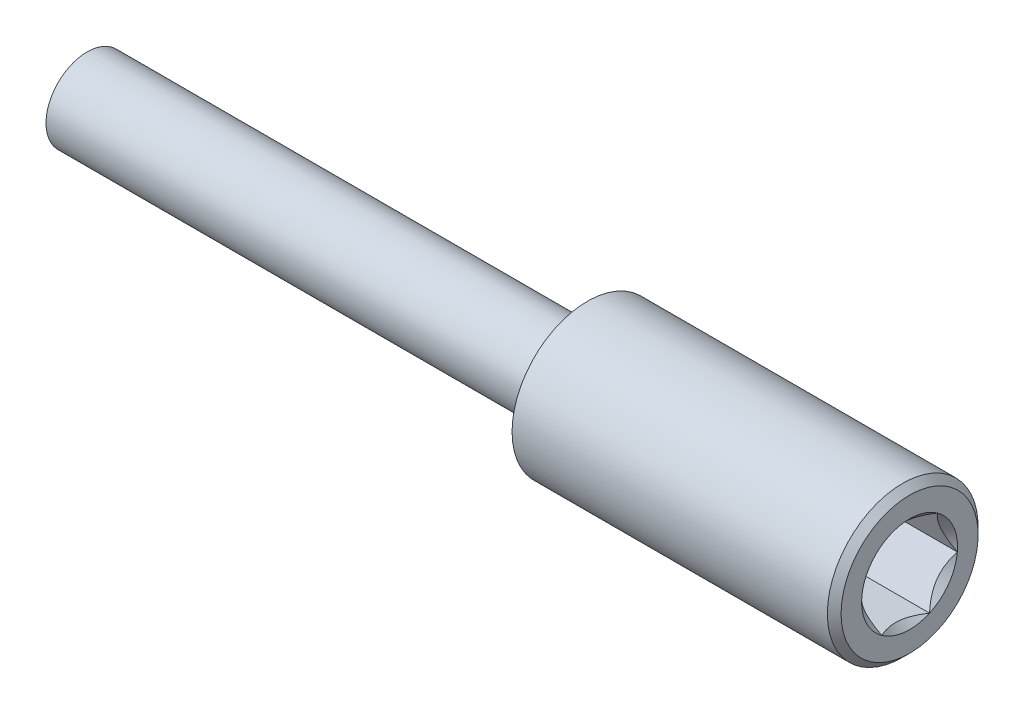
ISO-10303-21;
HEADER;
FILE_DESCRIPTION(('STEP AP214'),'2;1');
FILE_NAME('part.step','',(''),(''),'','','');
FILE_SCHEMA(('AUTOMOTIVE_DESIGN { 1 0 10303 214 1 1 1 1 }'));
ENDSEC;
DATA;
#1=APPLICATION_CONTEXT('core data for automotive mechanical design processes');
#2=APPLICATION_PROTOCOL_DEFINITION('international standard','automotive_design',2000,#1);
#3=PRODUCT_CONTEXT('',#1,'mechanical');
#4=PRODUCT('Part','Part','',(#3));
#5=PRODUCT_RELATED_PRODUCT_CATEGORY('part','',(#4));
#6=PRODUCT_DEFINITION_FORMATION('','',#4);
#7=PRODUCT_DEFINITION_CONTEXT('part definition',#1,'design');
#8=PRODUCT_DEFINITION('design','',#6,#7);
#9=PRODUCT_DEFINITION_SHAPE('','',#8);
#10=(LENGTH_UNIT() NAMED_UNIT(*) SI_UNIT(.MILLI.,.METRE.));
#11=(NAMED_UNIT(*) PLANE_ANGLE_UNIT() SI_UNIT($,.RADIAN.));
#12=(NAMED_UNIT(*) SI_UNIT($,.STERADIAN.) SOLID_ANGLE_UNIT());
#13=UNCERTAINTY_MEASURE_WITH_UNIT(LENGTH_MEASURE(1.E-05),#10,'distance_accuracy_value','');
#14=(GEOMETRIC_REPRESENTATION_CONTEXT(3) GLOBAL_UNCERTAINTY_ASSIGNED_CONTEXT((#13)) GLOBAL_UNIT_ASSIGNED_CONTEXT((#10,
#11,#12)) REPRESENTATION_CONTEXT('',''));
#15=CARTESIAN_POINT('',(0.,0.,0.));
#16=DIRECTION('',(0.,0.,1.));
#17=DIRECTION('',(1.,0.,0.));
#18=AXIS2_PLACEMENT_3D('',#15,#16,#17);
#19=CARTESIAN_POINT('',(59.5,0.,0.));
#20=DIRECTION('',(1.,0.,0.));
#21=DIRECTION('',(0.,0.,-1.));
#22=AXIS2_PLACEMENT_3D('',#19,#20,#21);
#23=CONICAL_SURFACE('',#22,3.,0.785398163397448);
#24=CARTESIAN_POINT('',(60.,0.,0.));
#25=DIRECTION('',(-1.,0.,0.));
#26=DIRECTION('',(0.,0.,1.));
#27=AXIS2_PLACEMENT_3D('',#24,#25,#26);
#28=CIRCLE('',#27,3.5);
#29=CARTESIAN_POINT('',(60.,-0.332480475621756,-3.48417231682509));
#30=VERTEX_POINT('',#29);
#31=CARTESIAN_POINT('',(60.,-3.18362197534389,-1.45414962026178));
#32=VERTEX_POINT('',#31);
#33=EDGE_CURVE('E203',#30,#32,#28,.T.);
#34=ORIENTED_EDGE('',*,*,#33,.F.);
#35=CARTESIAN_POINT('',(60.0001227643079,-0.332280475621751,-3.48431471752297));
#36=CARTESIAN_POINT('',(59.9400184649852,-0.430287651632948,-3.41453326621717));
#37=CARTESIAN_POINT('',(59.8834442018458,-0.529933641265409,-3.34358497389456));
#38=CARTESIAN_POINT('',(59.779858109961,-0.733122746907622,-3.19891362167009));
#39=CARTESIAN_POINT('',(59.7329039155234,-0.836685186248848,-3.1251768034888));
#40=CARTESIAN_POINT('',(59.6524704780716,-1.04551387618945,-2.97649004756514));
#41=CARTESIAN_POINT('',(59.6187890710241,-1.15072694511571,-2.9015779753596));
#42=CARTESIAN_POINT('',(59.5668959277097,-1.36346937048158,-2.75010462615658));
#43=CARTESIAN_POINT('',(59.548645455229,-1.47099222795744,-2.67354797644396));
#44=CARTESIAN_POINT('',(59.5321787016966,-1.65630263429938,-2.54160632050715));
#45=CARTESIAN_POINT('',(59.5297410907443,-1.73385085854029,-2.48639171425117));
#46=CARTESIAN_POINT('',(59.5338481550161,-1.88882117714828,-2.37605230664951));
#47=CARTESIAN_POINT('',(59.5403959791797,-1.96624321777301,-2.32092754356856));
#48=CARTESIAN_POINT('',(59.5621000444776,-2.12035382194239,-2.21120025564706));
#49=CARTESIAN_POINT('',(59.5772659149578,-2.19704146728263,-2.15659838457126));
#50=CARTESIAN_POINT('',(59.6153782933601,-2.34909968042144,-2.04833240622515));
#51=CARTESIAN_POINT('',(59.6383242047838,-2.42447034872738,-1.99466822739322));
#52=CARTESIAN_POINT('',(59.6855351614645,-2.55827709080356,-1.8993973601303));
#53=CARTESIAN_POINT('',(59.7085593472534,-2.61700930086291,-1.85757982162811));
#54=CARTESIAN_POINT('',(59.7583185724391,-2.73341926963525,-1.77469551766176));
#55=CARTESIAN_POINT('',(59.78505372513,-2.79109699609446,-1.73362877516238));
#56=CARTESIAN_POINT('',(59.8416354626562,-2.9052162901392,-1.65237543959514));
#57=CARTESIAN_POINT('',(59.8714722639292,-2.96166110360027,-1.61218653545256));
#58=CARTESIAN_POINT('',(59.9338654192506,-3.07350533311303,-1.53255305377069));
#59=CARTESIAN_POINT('',(59.9664201040844,-3.12890536556527,-1.49310803735206));
#60=CARTESIAN_POINT('',(60.0001227643079,-3.18382197534389,-1.4540072195639));
#61=B_SPLINE_CURVE_WITH_KNOTS('',3,(#35,#36,#37,#38,#39,#40,#41,#42,#43,#44,#45,#46,#47,#48,#49,
#50,#51,#52,#53,#54,#55,#56,#57,#58,#59,#60),.UNSPECIFIED.,.F.,.F.,(4,2,2,2,2,2,2,2,2,2,2,2,4),
(0.,0.403747524010755,0.809847411676119,1.20949767232449,1.60814168848214,1.89342103429884,
2.17880038159955,2.46449922533792,2.75017616939724,2.97712615115418,3.20408306311442,
3.43034463854694,3.65646826132234),.UNSPECIFIED.);
#62=EDGE_CURVE('E92',#30,#32,#61,.T.);
#63=ORIENTED_EDGE('',*,*,#62,.T.);
#64=EDGE_LOOP('',(#34,#63));
#65=FACE_BOUND('',#64,.T.);
#66=ADVANCED_FACE('F33',(#65),#23,.F.);
#67=CARTESIAN_POINT('',(60.,-2.85114149972214,2.03002269656331));
#68=VERTEX_POINT('',#67);
#69=EDGE_CURVE('E200',#32,#68,#28,.T.);
#70=ORIENTED_EDGE('',*,*,#69,.F.);
#71=CARTESIAN_POINT('',(60.0001004585984,-3.18364106053517,-1.45434962026178));
#72=CARTESIAN_POINT('',(59.9399986422745,-3.17221239446891,-1.33458486760425));
#73=CARTESIAN_POINT('',(59.8834268211516,-3.16059262810559,-1.21281751204651));
#74=CARTESIAN_POINT('',(59.7798453879084,-3.1368986645929,-0.964520671179666));
#75=CARTESIAN_POINT('',(59.7328934042563,-3.1248222143666,-0.837967575135955));
#76=CARTESIAN_POINT('',(59.6524638590217,-3.10047063467849,-0.58277935795841));
#77=CARTESIAN_POINT('',(59.6187841526979,-3.08820170614936,-0.45420921843856));
#78=CARTESIAN_POINT('',(59.5668937293435,-3.06339375856841,-0.194238571930213));
#79=CARTESIAN_POINT('',(59.5486442807415,-3.05085549726763,-0.0628460056641706));
#80=CARTESIAN_POINT('',(59.5321783788918,-3.0292462040212,0.163604889458532));
#81=CARTESIAN_POINT('',(59.5297410190727,-3.02020307670531,0.258370796517042));
#82=CARTESIAN_POINT('',(59.5338485571552,-3.00213153276675,0.447748452438848));
#83=CARTESIAN_POINT('',(59.540396603883,-2.9931031224117,0.542360135621654));
#84=CARTESIAN_POINT('',(59.5621010720019,-2.97513183712947,0.730687148090679));
#85=CARTESIAN_POINT('',(59.5772671218345,-2.96618906926906,0.824401355388862));
#86=CARTESIAN_POINT('',(59.6153798118535,-2.94845712263972,1.01022025935264));
#87=CARTESIAN_POINT('',(59.6383258555062,-2.9396679321495,1.10232507884939));
#88=CARTESIAN_POINT('',(59.6855357452147,-2.92406476091759,1.26583584488525));
#89=CARTESIAN_POINT('',(59.7085584836409,-2.91721623963544,1.33760375311456));
#90=CARTESIAN_POINT('',(59.7583143707402,-2.9036421448711,1.47985115911766));
#91=CARTESIAN_POINT('',(59.785047632437,-2.89691657514112,1.55033061757086));
#92=CARTESIAN_POINT('',(59.8416252414419,-2.88360957241706,1.68977907818912));
#93=CARTESIAN_POINT('',(59.8714598058761,-2.87702776094299,1.75875204657061));
#94=CARTESIAN_POINT('',(59.9338482201645,-2.86398602997516,1.89542063715966));
#95=CARTESIAN_POINT('',(59.9664004014243,-2.8575260386289,1.96311701233314));
#96=CARTESIAN_POINT('',(60.0001004585984,-2.85112241453085,2.03022269656331));
#97=B_SPLINE_CURVE_WITH_KNOTS('',3,(#71,#72,#73,#74,#75,#76,#77,#78,#79,#80,#81,#82,#83,#84,#85,
#86,#87,#88,#89,#90,#91,#92,#93,#94,#95,#96),.UNSPECIFIED.,.F.,.F.,(4,2,2,2,2,2,2,2,2,2,2,2,4),
(0.,0.403736953958613,0.809826034472715,1.20946604737607,1.60809991831549,1.89337885832153,
2.17875779639031,2.46445620198937,2.75013270652109,2.9770686230892,3.20401145370647,
3.4302589638345,3.65636856734248),.UNSPECIFIED.);
#98=EDGE_CURVE('E170',#32,#68,#97,.T.);
#99=ORIENTED_EDGE('',*,*,#98,.T.);
#100=EDGE_LOOP('',(#70,#99));
#101=FACE_BOUND('',#100,.T.);
#102=ADVANCED_FACE('F215',(#101),#23,.F.);
#103=CARTESIAN_POINT('',(60.,0.332480475621752,3.48417231682509));
#104=VERTEX_POINT('',#103);
#105=EDGE_CURVE('E192',#68,#104,#28,.T.);
#106=ORIENTED_EDGE('',*,*,#105,.F.);
#107=CARTESIAN_POINT('',(60.0001099428553,-2.85134149972214,2.02993134466089));
#108=CARTESIAN_POINT('',(59.94000707078,-2.74190680829199,2.07991668092853));
#109=CARTESIAN_POINT('',(59.883434211331,-2.63064223381862,2.13073783368224));
#110=CARTESIAN_POINT('',(59.7798507972696,-2.40376164138351,2.23436770239448));
#111=CARTESIAN_POINT('',(59.7328978736084,-2.28812404826025,2.28718627301325));
#112=CARTESIAN_POINT('',(59.65246667343,-2.05494640526849,2.3936923794656));
#113=CARTESIAN_POINT('',(59.6187862439688,-1.93746573463849,2.44735279326717));
#114=CARTESIAN_POINT('',(59.5668946640999,-1.69991810076775,2.5558549346214));
#115=CARTESIAN_POINT('',(59.5486447801468,-1.57985839373133,2.61069334783373));
#116=CARTESIAN_POINT('',(59.5321785161534,-1.37294017795202,2.70520521112373));
#117=CARTESIAN_POINT('',(59.529741049547,-1.28634888153384,2.74475660943033));
#118=CARTESIAN_POINT('',(59.5338483861532,-1.11330713960703,2.8237950710508));
#119=CARTESIAN_POINT('',(59.5403963382404,-1.02685675411091,2.86328210695338));
#120=CARTESIAN_POINT('',(59.5621006350665,-0.854775006367357,2.94188208209906));
#121=CARTESIAN_POINT('',(59.5772666086316,-0.769144669355587,2.98099455305602));
#122=CARTESIAN_POINT('',(59.6153791661373,-0.599354664595003,3.05854775279487));
#123=CARTESIAN_POINT('',(59.6383251535592,-0.515194884613918,3.09698853283993));
#124=CARTESIAN_POINT('',(59.6855354969358,-0.365786993656705,3.16523200822179));
#125=CARTESIAN_POINT('',(59.7085588507772,-0.300208173571147,3.19518575809008));
#126=CARTESIAN_POINT('',(59.7583161572219,-0.170227864760296,3.25455550052892));
#127=CARTESIAN_POINT('',(59.7850502229638,-0.105826412000395,3.28397147667194));
#128=CARTESIAN_POINT('',(59.8416295874039,0.0215962681448328,3.34217299788927));
#129=CARTESIAN_POINT('',(59.8714651029353,0.0846211197431761,3.37096019835734));
#130=CARTESIAN_POINT('',(59.9338555330978,0.209503601389775,3.42800145974772));
#131=CARTESIAN_POINT('',(59.9664087788708,0.271361919565443,3.45625583497877));
#132=CARTESIAN_POINT('',(60.0001099428553,0.332680475621751,3.48426366872752));
#133=B_SPLINE_CURVE_WITH_KNOTS('',3,(#107,#108,#109,#110,#111,#112,#113,#114,#115,#116,#117,
#118,#119,#120,#121,#122,#123,#124,#125,#126,#127,#128,#129,#130,#131,#132),.UNSPECIFIED.,.F.,
.F.,(4,2,2,2,2,2,2,2,2,2,2,2,4),(0.,0.403741448249491,0.80983512386516,1.2094794940198,
1.60811767861781,1.89339679115885,2.17877590321721,2.46447449509726,2.75015118650036,
2.97709308359678,3.20404190161065,3.43029539231469,3.65641095682473),.UNSPECIFIED.);
#134=EDGE_CURVE('E217',#68,#104,#133,.T.);
#135=ORIENTED_EDGE('',*,*,#134,.T.);
#136=EDGE_LOOP('',(#106,#135));
#137=FACE_BOUND('',#136,.T.);
#138=ADVANCED_FACE('F220',(#137),#23,.F.);
#139=CARTESIAN_POINT('',(60.,3.18362197534389,1.45414962026178));
#140=VERTEX_POINT('',#139);
#141=EDGE_CURVE('E42',#104,#140,#28,.T.);
#142=ORIENTED_EDGE('',*,*,#141,.F.);
#143=CARTESIAN_POINT('',(60.0001227643079,0.332280475621753,3.48431471752297));
#144=CARTESIAN_POINT('',(59.9400184649852,0.43028765163295,3.41453326621717));
#145=CARTESIAN_POINT('',(59.8834442018458,0.52993364126541,3.34358497389456));
#146=CARTESIAN_POINT('',(59.779858109961,0.733122746907623,3.19891362167009));
#147=CARTESIAN_POINT('',(59.7329039155234,0.836685186248848,3.1251768034888));
#148=CARTESIAN_POINT('',(59.6524704780716,1.04551387618945,2.97649004756514));
#149=CARTESIAN_POINT('',(59.6187890710241,1.15072694511571,2.90157797535961));
#150=CARTESIAN_POINT('',(59.5668959277097,1.36346937048158,2.75010462615658));
#151=CARTESIAN_POINT('',(59.548645455229,1.47099222795744,2.67354797644396));
#152=CARTESIAN_POINT('',(59.5321787016966,1.65630263429938,2.54160632050715));
#153=CARTESIAN_POINT('',(59.5297410907443,1.73385085854029,2.48639171425117));
#154=CARTESIAN_POINT('',(59.5338481550161,1.88882117714828,2.37605230664951));
#155=CARTESIAN_POINT('',(59.5403959791797,1.96624321777301,2.32092754356856));
#156=CARTESIAN_POINT('',(59.5621000444776,2.12035382194239,2.21120025564706));
#157=CARTESIAN_POINT('',(59.5772659149578,2.19704146728263,2.15659838457126));
#158=CARTESIAN_POINT('',(59.6153782933601,2.34909968042143,2.04833240622515));
#159=CARTESIAN_POINT('',(59.6383242047838,2.42447034872737,1.99466822739323));
#160=CARTESIAN_POINT('',(59.6855351614645,2.55827709080356,1.8993973601303));
#161=CARTESIAN_POINT('',(59.7085593472534,2.61700930086292,1.85757982162811));
#162=CARTESIAN_POINT('',(59.7583185724391,2.73341926963525,1.77469551766175));
#163=CARTESIAN_POINT('',(59.78505372513,2.79109699609446,1.73362877516238));
#164=CARTESIAN_POINT('',(59.8416354626563,2.90521629013921,1.65237543959514));
#165=CARTESIAN_POINT('',(59.8714722639292,2.96166110360028,1.61218653545256));
#166=CARTESIAN_POINT('',(59.9338654192505,3.07350533311304,1.53255305377069));
#167=CARTESIAN_POINT('',(59.9664201040844,3.12890536556528,1.49310803735206));
#168=CARTESIAN_POINT('',(60.0001227643079,3.18382197534389,1.4540072195639));
#169=B_SPLINE_CURVE_WITH_KNOTS('',3,(#143,#144,#145,#146,#147,#148,#149,#150,#151,#152,#153,
#154,#155,#156,#157,#158,#159,#160,#161,#162,#163,#164,#165,#166,#167,#168),.UNSPECIFIED.,.F.,
.F.,(4,2,2,2,2,2,2,2,2,2,2,2,4),(0.,0.403747524010754,0.809847411676117,1.20949767232449,
1.60814168848214,1.89342103429884,2.17880038159955,2.46449922533791,2.75017616939724,
2.97712615115418,3.20408306311442,3.43034463854694,3.65646826132234),.UNSPECIFIED.);
#170=EDGE_CURVE('E222',#104,#140,#169,.T.);
#171=ORIENTED_EDGE('',*,*,#170,.T.);
#172=EDGE_LOOP('',(#142,#171));
#173=FACE_BOUND('',#172,.T.);
#174=ADVANCED_FACE('F260',(#173),#23,.F.);
#175=CARTESIAN_POINT('',(60.,2.85114149972214,-2.03002269656331));
#176=VERTEX_POINT('',#175);
#177=EDGE_CURVE('E194',#140,#176,#28,.T.);
#178=ORIENTED_EDGE('',*,*,#177,.F.);
#179=CARTESIAN_POINT('',(60.0001004585984,3.18364106053517,1.45434962026178));
#180=CARTESIAN_POINT('',(59.9399986422745,3.17221239446891,1.33458486760425));
#181=CARTESIAN_POINT('',(59.8834268211516,3.16059262810559,1.21281751204651));
#182=CARTESIAN_POINT('',(59.7798453879084,3.1368986645929,0.964520671179666));
#183=CARTESIAN_POINT('',(59.7328934042563,3.1248222143666,0.837967575135956));
#184=CARTESIAN_POINT('',(59.6524638590217,3.10047063467849,0.582779357958415));
#185=CARTESIAN_POINT('',(59.6187841526979,3.08820170614936,0.454209218438566));
#186=CARTESIAN_POINT('',(59.5668937293435,3.06339375856841,0.19423857193022));
#187=CARTESIAN_POINT('',(59.5486442807415,3.05085549726763,0.0628460056641774));
#188=CARTESIAN_POINT('',(59.5321783788918,3.0292462040212,-0.163604889458526));
#189=CARTESIAN_POINT('',(59.5297410190727,3.02020307670531,-0.258370796517035));
#190=CARTESIAN_POINT('',(59.5338485571552,3.00213153276675,-0.447748452438841));
#191=CARTESIAN_POINT('',(59.540396603883,2.9931031224117,-0.542360135621647));
#192=CARTESIAN_POINT('',(59.5621010720019,2.97513183712947,-0.730687148090672));
#193=CARTESIAN_POINT('',(59.5772671218345,2.96618906926907,-0.824401355388855));
#194=CARTESIAN_POINT('',(59.6153798118535,2.94845712263972,-1.01022025935263));
#195=CARTESIAN_POINT('',(59.6383258555062,2.9396679321495,-1.10232507884938));
#196=CARTESIAN_POINT('',(59.6855357452147,2.92406476091759,-1.26583584488524));
#197=CARTESIAN_POINT('',(59.7085584836409,2.91721623963544,-1.33760375311456));
#198=CARTESIAN_POINT('',(59.7583143707402,2.9036421448711,-1.47985115911766));
#199=CARTESIAN_POINT('',(59.785047632437,2.89691657514112,-1.55033061757086));
#200=CARTESIAN_POINT('',(59.8416252414419,2.88360957241706,-1.68977907818912));
#201=CARTESIAN_POINT('',(59.8714598058761,2.87702776094299,-1.75875204657061));
#202=CARTESIAN_POINT('',(59.9338482201645,2.86398602997516,-1.89542063715966));
#203=CARTESIAN_POINT('',(59.9664004014243,2.8575260386289,-1.96311701233314));
#204=CARTESIAN_POINT('',(60.0001004585984,2.85112241453086,-2.03022269656331));
#205=B_SPLINE_CURVE_WITH_KNOTS('',3,(#179,#180,#181,#182,#183,#184,#185,#186,#187,#188,#189,
#190,#191,#192,#193,#194,#195,#196,#197,#198,#199,#200,#201,#202,#203,#204),.UNSPECIFIED.,.F.,
.F.,(4,2,2,2,2,2,2,2,2,2,2,2,4),(0.,0.403736953958614,0.809826034472712,1.20946604737607,
1.60809991831548,1.89337885832152,2.1787577963903,2.46445620198936,2.75013270652108,
2.97706862308919,3.20401145370647,3.4302589638345,3.65636856734248),.UNSPECIFIED.);
#206=EDGE_CURVE('E139',#140,#176,#205,.T.);
#207=ORIENTED_EDGE('',*,*,#206,.T.);
#208=EDGE_LOOP('',(#178,#207));
#209=FACE_BOUND('',#208,.T.);
#210=ADVANCED_FACE('F251',(#209),#23,.F.);
#211=CARTESIAN_POINT('',(0.,0.,-3.));
#212=DIRECTION('',(1.,0.,0.));
#213=DIRECTION('',(0.,0.,-1.));
#214=AXIS2_PLACEMENT_3D('',#211,#212,#213);
#215=PLANE('',#214);
#216=CARTESIAN_POINT('',(0.,0.,0.));
#217=DIRECTION('',(-1.,0.,0.));
#218=DIRECTION('',(0.,0.,1.));
#219=AXIS2_PLACEMENT_3D('',#216,#217,#218);
#220=CIRCLE('',#219,3.);
#221=CARTESIAN_POINT('',(0.,0.,3.));
#222=VERTEX_POINT('',#221);
#223=EDGE_CURVE('E177',#222,#222,#220,.T.);
#224=ORIENTED_EDGE('',*,*,#223,.T.);
#225=EDGE_LOOP('',(#224));
#226=FACE_BOUND('',#225,.T.);
#227=ADVANCED_FACE('F35',(#226),#215,.F.);
#228=EDGE_CURVE('E199',#176,#30,#28,.T.);
#229=ORIENTED_EDGE('',*,*,#228,.F.);
#230=CARTESIAN_POINT('',(60.0001099428553,2.85134149972214,-2.02993134466089));
#231=CARTESIAN_POINT('',(59.94000707078,2.74190680829199,-2.07991668092853));
#232=CARTESIAN_POINT('',(59.883434211331,2.63064223381862,-2.13073783368224));
#233=CARTESIAN_POINT('',(59.7798507972696,2.40376164138351,-2.23436770239448));
#234=CARTESIAN_POINT('',(59.7328978736084,2.28812404826026,-2.28718627301325));
#235=CARTESIAN_POINT('',(59.65246667343,2.05494640526849,-2.3936923794656));
#236=CARTESIAN_POINT('',(59.6187862439688,1.93746573463849,-2.44735279326717));
#237=CARTESIAN_POINT('',(59.5668946640999,1.69991810076775,-2.5558549346214));
#238=CARTESIAN_POINT('',(59.5486447801468,1.57985839373133,-2.61069334783373));
#239=CARTESIAN_POINT('',(59.5321785161534,1.37294017795202,-2.70520521112372));
#240=CARTESIAN_POINT('',(59.529741049547,1.28634888153384,-2.74475660943033));
#241=CARTESIAN_POINT('',(59.5338483861532,1.11330713960703,-2.8237950710508));
#242=CARTESIAN_POINT('',(59.5403963382404,1.02685675411091,-2.86328210695338));
#243=CARTESIAN_POINT('',(59.5621006350665,0.854775006367358,-2.94188208209906));
#244=CARTESIAN_POINT('',(59.5772666086316,0.769144669355587,-2.98099455305602));
#245=CARTESIAN_POINT('',(59.6153791661373,0.599354664595004,-3.05854775279487));
#246=CARTESIAN_POINT('',(59.6383251535593,0.51519488461392,-3.09698853283993));
#247=CARTESIAN_POINT('',(59.6855354969358,0.365786993656706,-3.16523200822179));
#248=CARTESIAN_POINT('',(59.7085588507772,0.300208173571147,-3.19518575809008));
#249=CARTESIAN_POINT('',(59.7583161572219,0.170227864760296,-3.25455550052892));
#250=CARTESIAN_POINT('',(59.7850502229638,0.105826412000396,-3.28397147667194));
#251=CARTESIAN_POINT('',(59.8416295874039,-0.0215962681448316,-3.34217299788927));
#252=CARTESIAN_POINT('',(59.8714651029353,-0.0846211197431752,-3.37096019835734));
#253=CARTESIAN_POINT('',(59.9338555330978,-0.209503601389774,-3.42800145974772));
#254=CARTESIAN_POINT('',(59.9664087788708,-0.271361919565443,-3.45625583497877));
#255=CARTESIAN_POINT('',(60.0001099428553,-0.332680475621749,-3.48426366872751));
#256=B_SPLINE_CURVE_WITH_KNOTS('',3,(#230,#231,#232,#233,#234,#235,#236,#237,#238,#239,#240,
#241,#242,#243,#244,#245,#246,#247,#248,#249,#250,#251,#252,#253,#254,#255),.UNSPECIFIED.,.F.,
.F.,(4,2,2,2,2,2,2,2,2,2,2,2,4),(0.,0.403741448249492,0.809835123865161,1.2094794940198,
1.60811767861782,1.89339679115885,2.17877590321721,2.46447449509726,2.75015118650036,
2.97709308359678,3.20404190161065,3.4302953923147,3.65641095682473),.UNSPECIFIED.);
#257=EDGE_CURVE('E121',#176,#30,#256,.T.);
#258=ORIENTED_EDGE('',*,*,#257,.T.);
#259=EDGE_LOOP('',(#229,#258));
#260=FACE_BOUND('',#259,.T.);
#261=ADVANCED_FACE('F146',(#260),#23,.F.);
#262=CARTESIAN_POINT('',(60.,0.,-3.5));
#263=DIRECTION('',(-1.,0.,0.));
#264=DIRECTION('',(0.,0.,1.));
#265=AXIS2_PLACEMENT_3D('',#262,#263,#264);
#266=PLANE('',#265);
#267=CARTESIAN_POINT('',(60.,0.,0.));
#268=DIRECTION('',(-1.,0.,0.));
#269=DIRECTION('',(0.,0.,1.));
#270=AXIS2_PLACEMENT_3D('',#267,#268,#269);
#271=CIRCLE('',#270,5.);
#272=CARTESIAN_POINT('',(60.,0.,5.));
#273=VERTEX_POINT('',#272);
#274=EDGE_CURVE('E189',#273,#273,#271,.T.);
#275=ORIENTED_EDGE('',*,*,#274,.F.);
#276=EDGE_LOOP('',(#275));
#277=FACE_BOUND('',#276,.T.);
#278=ORIENTED_EDGE('',*,*,#141,.T.);
#279=ORIENTED_EDGE('',*,*,#177,.T.);
#280=ORIENTED_EDGE('',*,*,#228,.T.);
#281=ORIENTED_EDGE('',*,*,#33,.T.);
#282=ORIENTED_EDGE('',*,*,#69,.T.);
#283=ORIENTED_EDGE('',*,*,#105,.T.);
#284=EDGE_LOOP('',(#278,#279,#280,#281,#282,#283));
#285=FACE_BOUND('',#284,.T.);
#286=ADVANCED_FACE('F209',(#277,#285),#266,.F.);
#287=CARTESIAN_POINT('',(60.,0.,0.));
#288=DIRECTION('',(-1.,0.,0.));
#289=DIRECTION('',(0.,0.,1.));
#290=AXIS2_PLACEMENT_3D('',#287,#288,#289);
#291=CONICAL_SURFACE('',#290,5.,0.785398163397447);
#292=CARTESIAN_POINT('',(59.5,0.,0.));
#293=DIRECTION('',(-1.,0.,0.));
#294=DIRECTION('',(0.,0.,1.));
#295=AXIS2_PLACEMENT_3D('',#292,#293,#294);
#296=CIRCLE('',#295,5.5);
#297=CARTESIAN_POINT('',(59.5,0.,5.5));
#298=VERTEX_POINT('',#297);
#299=EDGE_CURVE('E186',#298,#298,#296,.T.);
#300=ORIENTED_EDGE('',*,*,#299,.F.);
#301=EDGE_LOOP('',(#300));
#302=FACE_BOUND('',#301,.T.);
#303=ORIENTED_EDGE('',*,*,#274,.T.);
#304=EDGE_LOOP('',(#303));
#305=FACE_BOUND('',#304,.T.);
#306=ADVANCED_FACE('F256',(#302,#305),#291,.T.);
#307=CARTESIAN_POINT('',(0.,0.,0.));
#308=DIRECTION('',(-1.,0.,0.));
#309=DIRECTION('',(0.,0.,1.));
#310=AXIS2_PLACEMENT_3D('',#307,#308,#309);
#311=CYLINDRICAL_SURFACE('',#310,5.5);
#312=CARTESIAN_POINT('',(36.5,0.,0.));
#313=DIRECTION('',(-1.,0.,0.));
#314=DIRECTION('',(0.,0.,1.));
#315=AXIS2_PLACEMENT_3D('',#312,#313,#314);
#316=CIRCLE('',#315,5.5);
#317=CARTESIAN_POINT('',(36.5,0.,5.5));
#318=VERTEX_POINT('',#317);
#319=EDGE_CURVE('E183',#318,#318,#316,.T.);
#320=ORIENTED_EDGE('',*,*,#319,.F.);
#321=EDGE_LOOP('',(#320));
#322=FACE_BOUND('',#321,.T.);
#323=ORIENTED_EDGE('',*,*,#299,.T.);
#324=EDGE_LOOP('',(#323));
#325=FACE_BOUND('',#324,.T.);
#326=ADVANCED_FACE('F327',(#322,#325),#311,.T.);
#327=CARTESIAN_POINT('',(36.5,0.,-5.5));
#328=DIRECTION('',(1.,0.,0.));
#329=DIRECTION('',(0.,0.,-1.));
#330=AXIS2_PLACEMENT_3D('',#327,#328,#329);
#331=PLANE('',#330);
#332=CARTESIAN_POINT('',(36.5,0.,0.));
#333=DIRECTION('',(-1.,0.,0.));
#334=DIRECTION('',(0.,0.,1.));
#335=AXIS2_PLACEMENT_3D('',#332,#333,#334);
#336=CIRCLE('',#335,3.);
#337=CARTESIAN_POINT('',(36.5,0.,3.));
#338=VERTEX_POINT('',#337);
#339=EDGE_CURVE('E180',#338,#338,#336,.T.);
#340=ORIENTED_EDGE('',*,*,#339,.F.);
#341=EDGE_LOOP('',(#340));
#342=FACE_BOUND('',#341,.T.);
#343=ORIENTED_EDGE('',*,*,#319,.T.);
#344=EDGE_LOOP('',(#343));
#345=FACE_BOUND('',#344,.T.);
#346=ADVANCED_FACE('F338',(#342,#345),#331,.F.);
#347=CARTESIAN_POINT('',(0.,0.,0.));
#348=DIRECTION('',(-1.,0.,0.));
#349=DIRECTION('',(0.,0.,1.));
#350=AXIS2_PLACEMENT_3D('',#347,#348,#349);
#351=CYLINDRICAL_SURFACE('',#350,3.);
#352=ORIENTED_EDGE('',*,*,#223,.F.);
#353=EDGE_LOOP('',(#352));
#354=FACE_BOUND('',#353,.T.);
#355=ORIENTED_EDGE('',*,*,#339,.T.);
#356=EDGE_LOOP('',(#355));
#357=FACE_BOUND('',#356,.T.);
#358=ADVANCED_FACE('F161',(#354,#357),#351,.T.);
#359=CARTESIAN_POINT('',(55.,0.,0.));
#360=DIRECTION('',(1.,0.,0.));
#361=DIRECTION('',(0.,0.,-1.));
#362=AXIS2_PLACEMENT_3D('',#359,#360,#361);
#363=PLANE('',#362);
#364=DIRECTION('',(0.,0.814611857063468,-0.580006484732376));
#365=VECTOR('',#364,1.);
#366=CARTESIAN_POINT('',(55.,-3.18362197534389,-1.45414962026178));
#367=LINE('',#366,#365);
#368=CARTESIAN_POINT('',(55.,-3.18362197534389,-1.45414962026178));
#369=VERTEX_POINT('',#368);
#370=CARTESIAN_POINT('',(55.,-0.33248047562175,-3.48417231682509));
#371=VERTEX_POINT('',#370);
#372=EDGE_CURVE('E89',#369,#371,#367,.T.);
#373=ORIENTED_EDGE('',*,*,#372,.T.);
#374=DIRECTION('',(0.,0.909606278669683,0.415471320074794));
#375=VECTOR('',#374,1.);
#376=CARTESIAN_POINT('',(55.,-0.33248047562175,-3.48417231682509));
#377=LINE('',#376,#375);
#378=CARTESIAN_POINT('',(55.,2.85114149972214,-2.03002269656331));
#379=VERTEX_POINT('',#378);
#380=EDGE_CURVE('E98',#371,#379,#377,.T.);
#381=ORIENTED_EDGE('',*,*,#380,.T.);
#382=DIRECTION('',(0.,0.0949944216062147,0.995477804807169));
#383=VECTOR('',#382,1.);
#384=CARTESIAN_POINT('',(55.,2.85114149972214,-2.03002269656331));
#385=LINE('',#384,#383);
#386=CARTESIAN_POINT('',(55.,3.18362197534389,1.45414962026178));
#387=VERTEX_POINT('',#386);
#388=EDGE_CURVE('E104',#379,#387,#385,.T.);
#389=ORIENTED_EDGE('',*,*,#388,.T.);
#390=DIRECTION('',(0.,-0.814611857063468,0.580006484732376));
#391=VECTOR('',#390,1.);
#392=CARTESIAN_POINT('',(55.,3.18362197534389,1.45414962026178));
#393=LINE('',#392,#391);
#394=CARTESIAN_POINT('',(55.,0.332480475621752,3.48417231682509));
#395=VERTEX_POINT('',#394);
#396=EDGE_CURVE('E113',#387,#395,#393,.T.);
#397=ORIENTED_EDGE('',*,*,#396,.T.);
#398=DIRECTION('',(0.,-0.909606278669683,-0.415471320074793));
#399=VECTOR('',#398,1.);
#400=CARTESIAN_POINT('',(55.,0.332480475621752,3.48417231682509));
#401=LINE('',#400,#399);
#402=CARTESIAN_POINT('',(55.,-2.85114149972214,2.03002269656331));
#403=VERTEX_POINT('',#402);
#404=EDGE_CURVE('E116',#395,#403,#401,.T.);
#405=ORIENTED_EDGE('',*,*,#404,.T.);
#406=DIRECTION('',(0.,-0.0949944216062148,-0.995477804807169));
#407=VECTOR('',#406,1.);
#408=CARTESIAN_POINT('',(55.,-2.85114149972214,2.03002269656331));
#409=LINE('',#408,#407);
#410=EDGE_CURVE('E95',#403,#369,#409,.T.);
#411=ORIENTED_EDGE('',*,*,#410,.T.);
#412=EDGE_LOOP('',(#373,#381,#389,#397,#405,#411));
#413=FACE_BOUND('',#412,.T.);
#414=CARTESIAN_POINT('',(55.,0.,0.));
#415=DIRECTION('',(1.,0.,0.));
#416=DIRECTION('',(0.,0.,-1.));
#417=AXIS2_PLACEMENT_3D('',#414,#415,#416);
#418=CIRCLE('',#417,2.5);
#419=CARTESIAN_POINT('',(55.,0.,-2.5));
#420=VERTEX_POINT('',#419);
#421=EDGE_CURVE('E37',#420,#420,#418,.F.);
#422=ORIENTED_EDGE('',*,*,#421,.T.);
#423=EDGE_LOOP('',(#422));
#424=FACE_BOUND('',#423,.T.);
#425=ADVANCED_FACE('F106',(#413,#424),#363,.T.);
#426=CARTESIAN_POINT('',(55.,-3.18362197534389,-1.45414962026178));
#427=DIRECTION('',(0.,-0.580006484732376,-0.814611857063468));
#428=DIRECTION('',(0.,0.814611857063469,-0.580006484732376));
#429=AXIS2_PLACEMENT_3D('',#426,#427,#428);
#430=PLANE('',#429);
#431=DIRECTION('',(1.,0.,0.));
#432=VECTOR('',#431,1.);
#433=CARTESIAN_POINT('',(55.,-0.33248047562175,-3.48417231682509));
#434=LINE('',#433,#432);
#435=EDGE_CURVE('E49',#371,#30,#434,.T.);
#436=ORIENTED_EDGE('',*,*,#435,.F.);
#437=ORIENTED_EDGE('',*,*,#372,.F.);
#438=DIRECTION('',(1.,0.,0.));
#439=VECTOR('',#438,1.);
#440=CARTESIAN_POINT('',(55.,-3.18362197534389,-1.45414962026178));
#441=LINE('',#440,#439);
#442=EDGE_CURVE('E119',#369,#32,#441,.T.);
#443=ORIENTED_EDGE('',*,*,#442,.T.);
#444=ORIENTED_EDGE('',*,*,#62,.F.);
#445=EDGE_LOOP('',(#436,#437,#443,#444));
#446=FACE_BOUND('',#445,.T.);
#447=ADVANCED_FACE('F86',(#446),#430,.F.);
#448=CARTESIAN_POINT('',(55.,-2.85114149972214,2.03002269656331));
#449=DIRECTION('',(0.,-0.995477804807169,0.0949944216062148));
#450=DIRECTION('',(0.,-0.0949944216062148,-0.99547780480717));
#451=AXIS2_PLACEMENT_3D('',#448,#449,#450);
#452=PLANE('',#451);
#453=ORIENTED_EDGE('',*,*,#442,.F.);
#454=ORIENTED_EDGE('',*,*,#410,.F.);
#455=DIRECTION('',(1.,0.,0.));
#456=VECTOR('',#455,1.);
#457=CARTESIAN_POINT('',(55.,-2.85114149972214,2.03002269656331));
#458=LINE('',#457,#456);
#459=EDGE_CURVE('E122',#403,#68,#458,.T.);
#460=ORIENTED_EDGE('',*,*,#459,.T.);
#461=ORIENTED_EDGE('',*,*,#98,.F.);
#462=EDGE_LOOP('',(#453,#454,#460,#461));
#463=FACE_BOUND('',#462,.T.);
#464=ADVANCED_FACE('F160',(#463),#452,.F.);
#465=CARTESIAN_POINT('',(55.,0.332480475621752,3.48417231682509));
#466=DIRECTION('',(0.,-0.415471320074793,0.909606278669683));
#467=DIRECTION('',(0.,-0.909606278669683,-0.415471320074793));
#468=AXIS2_PLACEMENT_3D('',#465,#466,#467);
#469=PLANE('',#468);
#470=ORIENTED_EDGE('',*,*,#459,.F.);
#471=ORIENTED_EDGE('',*,*,#404,.F.);
#472=DIRECTION('',(1.,0.,0.));
#473=VECTOR('',#472,1.);
#474=CARTESIAN_POINT('',(55.,0.332480475621752,3.48417231682509));
#475=LINE('',#474,#473);
#476=EDGE_CURVE('E125',#395,#104,#475,.T.);
#477=ORIENTED_EDGE('',*,*,#476,.T.);
#478=ORIENTED_EDGE('',*,*,#134,.F.);
#479=EDGE_LOOP('',(#470,#471,#477,#478));
#480=FACE_BOUND('',#479,.T.);
#481=ADVANCED_FACE('F233',(#480),#469,.F.);
#482=CARTESIAN_POINT('',(55.,3.18362197534389,1.45414962026178));
#483=DIRECTION('',(0.,0.580006484732376,0.814611857063468));
#484=DIRECTION('',(0.,-0.814611857063468,0.580006484732376));
#485=AXIS2_PLACEMENT_3D('',#482,#483,#484);
#486=PLANE('',#485);
#487=ORIENTED_EDGE('',*,*,#476,.F.);
#488=ORIENTED_EDGE('',*,*,#396,.F.);
#489=DIRECTION('',(1.,0.,0.));
#490=VECTOR('',#489,1.);
#491=CARTESIAN_POINT('',(55.,3.18362197534389,1.45414962026178));
#492=LINE('',#491,#490);
#493=EDGE_CURVE('E128',#387,#140,#492,.T.);
#494=ORIENTED_EDGE('',*,*,#493,.T.);
#495=ORIENTED_EDGE('',*,*,#170,.F.);
#496=EDGE_LOOP('',(#487,#488,#494,#495));
#497=FACE_BOUND('',#496,.T.);
#498=ADVANCED_FACE('F236',(#497),#486,.F.);
#499=CARTESIAN_POINT('',(55.,2.85114149972214,-2.03002269656331));
#500=DIRECTION('',(0.,0.995477804807169,-0.0949944216062147));
#501=DIRECTION('',(0.,0.0949944216062147,0.995477804807169));
#502=AXIS2_PLACEMENT_3D('',#499,#500,#501);
#503=PLANE('',#502);
#504=ORIENTED_EDGE('',*,*,#493,.F.);
#505=ORIENTED_EDGE('',*,*,#388,.F.);
#506=DIRECTION('',(1.,0.,0.));
#507=VECTOR('',#506,1.);
#508=CARTESIAN_POINT('',(55.,2.85114149972214,-2.03002269656331));
#509=LINE('',#508,#507);
#510=EDGE_CURVE('E94',#379,#176,#509,.T.);
#511=ORIENTED_EDGE('',*,*,#510,.T.);
#512=ORIENTED_EDGE('',*,*,#206,.F.);
#513=EDGE_LOOP('',(#504,#505,#511,#512));
#514=FACE_BOUND('',#513,.T.);
#515=ADVANCED_FACE('F154',(#514),#503,.F.);
#516=CARTESIAN_POINT('',(55.,-0.33248047562175,-3.48417231682509));
#517=DIRECTION('',(0.,0.415471320074794,-0.909606278669683));
#518=DIRECTION('',(0.,0.909606278669683,0.415471320074794));
#519=AXIS2_PLACEMENT_3D('',#516,#517,#518);
#520=PLANE('',#519);
#521=ORIENTED_EDGE('',*,*,#510,.F.);
#522=ORIENTED_EDGE('',*,*,#380,.F.);
#523=ORIENTED_EDGE('',*,*,#435,.T.);
#524=ORIENTED_EDGE('',*,*,#257,.F.);
#525=EDGE_LOOP('',(#521,#522,#523,#524));
#526=FACE_BOUND('',#525,.T.);
#527=ADVANCED_FACE('F99',(#526),#520,.F.);
#528=CARTESIAN_POINT('',(49.5566243270259,0.,0.));
#529=DIRECTION('',(1.,0.,0.));
#530=DIRECTION('',(0.,0.,-1.));
#531=AXIS2_PLACEMENT_3D('',#528,#529,#530);
#532=CONICAL_SURFACE('',#531,0.,1.04719755119659);
#533=CARTESIAN_POINT('',(51.,0.,0.));
#534=DIRECTION('',(-1.,0.,0.));
#535=DIRECTION('',(0.,0.,1.));
#536=AXIS2_PLACEMENT_3D('',#533,#534,#535);
#537=CIRCLE('',#536,2.5);
#538=CARTESIAN_POINT('',(51.,0.,2.5));
#539=VERTEX_POINT('',#538);
#540=EDGE_CURVE('E11',#539,#539,#537,.T.);
#541=ORIENTED_EDGE('',*,*,#540,.F.);
#542=EDGE_LOOP('',(#541));
#543=FACE_BOUND('',#542,.T.);
#544=CARTESIAN_POINT('',(49.5566243270259,0.,0.));
#545=VERTEX_POINT('',#544);
#546=VERTEX_LOOP('',#545);
#547=FACE_BOUND('',#546,.T.);
#548=ADVANCED_FACE('F153',(#543,#547),#532,.F.);
#549=CARTESIAN_POINT('',(0.,0.,0.));
#550=DIRECTION('',(-1.,0.,0.));
#551=DIRECTION('',(0.,0.,1.));
#552=AXIS2_PLACEMENT_3D('',#549,#550,#551);
#553=CYLINDRICAL_SURFACE('',#552,2.5);
#554=ORIENTED_EDGE('',*,*,#540,.T.);
#555=EDGE_LOOP('',(#554));
#556=FACE_BOUND('',#555,.T.);
#557=ORIENTED_EDGE('',*,*,#421,.F.);
#558=EDGE_LOOP('',(#557));
#559=FACE_BOUND('',#558,.T.);
#560=ADVANCED_FACE('F301',(#556,#559),#553,.F.);
#561=CLOSED_SHELL('',(#66,#102,#138,#174,#210,#227,#261,#286,#306,#326,#346,#358,#425,#447,#464,
#481,#498,#515,#527,#548,#560));
#562=MANIFOLD_SOLID_BREP('B2',#561);
#563=ADVANCED_BREP_SHAPE_REPRESENTATION('',(#18,#562),#14);
#564=SHAPE_DEFINITION_REPRESENTATION(#9,#563);
ENDSEC;
END-ISO-10303-21;
